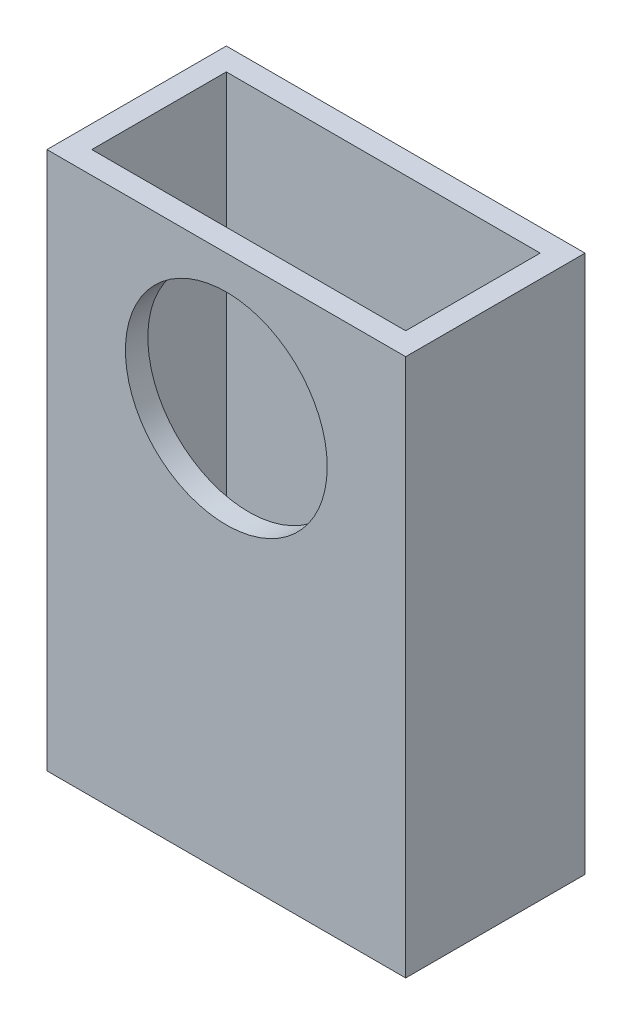
ISO-10303-21;
HEADER;
FILE_DESCRIPTION(('STEP AP214'),'2;1');
FILE_NAME('part.step','',(''),(''),'','','');
FILE_SCHEMA(('AUTOMOTIVE_DESIGN { 1 0 10303 214 1 1 1 1 }'));
ENDSEC;
DATA;
#1=APPLICATION_CONTEXT('core data for automotive mechanical design processes');
#2=APPLICATION_PROTOCOL_DEFINITION('international standard','automotive_design',2000,#1);
#3=PRODUCT_CONTEXT('',#1,'mechanical');
#4=PRODUCT('Part','Part','',(#3));
#5=PRODUCT_RELATED_PRODUCT_CATEGORY('part','',(#4));
#6=PRODUCT_DEFINITION_FORMATION('','',#4);
#7=PRODUCT_DEFINITION_CONTEXT('part definition',#1,'design');
#8=PRODUCT_DEFINITION('design','',#6,#7);
#9=PRODUCT_DEFINITION_SHAPE('','',#8);
#10=(LENGTH_UNIT() NAMED_UNIT(*) SI_UNIT(.MILLI.,.METRE.));
#11=(NAMED_UNIT(*) PLANE_ANGLE_UNIT() SI_UNIT($,.RADIAN.));
#12=(NAMED_UNIT(*) SI_UNIT($,.STERADIAN.) SOLID_ANGLE_UNIT());
#13=UNCERTAINTY_MEASURE_WITH_UNIT(LENGTH_MEASURE(1.E-05),#10,'distance_accuracy_value','');
#14=(GEOMETRIC_REPRESENTATION_CONTEXT(3) GLOBAL_UNCERTAINTY_ASSIGNED_CONTEXT((#13)) GLOBAL_UNIT_ASSIGNED_CONTEXT((#10,
#11,#12)) REPRESENTATION_CONTEXT('',''));
#15=CARTESIAN_POINT('',(0.,0.,0.));
#16=DIRECTION('',(0.,0.,1.));
#17=DIRECTION('',(1.,0.,0.));
#18=AXIS2_PLACEMENT_3D('',#15,#16,#17);
#19=CARTESIAN_POINT('',(0.,0.,25.4));
#20=DIRECTION('',(1.,0.,0.));
#21=DIRECTION('',(0.,1.,0.));
#22=AXIS2_PLACEMENT_3D('',#19,#20,#21);
#23=PLANE('',#22);
#24=DIRECTION('',(0.,-1.,0.));
#25=VECTOR('',#24,1.);
#26=CARTESIAN_POINT('',(0.,0.,0.));
#27=LINE('',#26,#25);
#28=CARTESIAN_POINT('',(0.,76.2,0.));
#29=VERTEX_POINT('',#28);
#30=CARTESIAN_POINT('',(0.,0.,0.));
#31=VERTEX_POINT('',#30);
#32=EDGE_CURVE('E150',#29,#31,#27,.T.);
#33=ORIENTED_EDGE('',*,*,#32,.T.);
#34=DIRECTION('',(0.,0.,-1.));
#35=VECTOR('',#34,1.);
#36=CARTESIAN_POINT('',(0.,0.,25.4));
#37=LINE('',#36,#35);
#38=CARTESIAN_POINT('',(0.,0.,25.4));
#39=VERTEX_POINT('',#38);
#40=EDGE_CURVE('E11',#39,#31,#37,.T.);
#41=ORIENTED_EDGE('',*,*,#40,.F.);
#42=DIRECTION('',(0.,-1.,0.));
#43=VECTOR('',#42,1.);
#44=CARTESIAN_POINT('',(0.,0.,25.4));
#45=LINE('',#44,#43);
#46=CARTESIAN_POINT('',(0.,76.2,25.4));
#47=VERTEX_POINT('',#46);
#48=EDGE_CURVE('E156',#47,#39,#45,.T.);
#49=ORIENTED_EDGE('',*,*,#48,.F.);
#50=DIRECTION('',(0.,0.,-1.));
#51=VECTOR('',#50,1.);
#52=CARTESIAN_POINT('',(0.,76.2,25.4));
#53=LINE('',#52,#51);
#54=EDGE_CURVE('E170',#47,#29,#53,.T.);
#55=ORIENTED_EDGE('',*,*,#54,.T.);
#56=EDGE_LOOP('',(#33,#41,#49,#55));
#57=FACE_BOUND('',#56,.T.);
#58=ADVANCED_FACE('F39',(#57),#23,.F.);
#59=CARTESIAN_POINT('',(0.,0.,25.4));
#60=DIRECTION('',(0.,1.,0.));
#61=DIRECTION('',(0.,0.,1.));
#62=AXIS2_PLACEMENT_3D('',#59,#60,#61);
#63=PLANE('',#62);
#64=DIRECTION('',(1.,0.,0.));
#65=VECTOR('',#64,1.);
#66=CARTESIAN_POINT('',(3.175,0.,3.175));
#67=LINE('',#66,#65);
#68=CARTESIAN_POINT('',(3.175,0.,3.175));
#69=VERTEX_POINT('',#68);
#70=CARTESIAN_POINT('',(47.625,0.,3.175));
#71=VERTEX_POINT('',#70);
#72=EDGE_CURVE('E141',#69,#71,#67,.T.);
#73=ORIENTED_EDGE('',*,*,#72,.F.);
#74=DIRECTION('',(0.,0.,-1.));
#75=VECTOR('',#74,1.);
#76=CARTESIAN_POINT('',(3.175,0.,22.225));
#77=LINE('',#76,#75);
#78=CARTESIAN_POINT('',(3.175,0.,22.225));
#79=VERTEX_POINT('',#78);
#80=EDGE_CURVE('E55',#79,#69,#77,.T.);
#81=ORIENTED_EDGE('',*,*,#80,.F.);
#82=DIRECTION('',(-1.,0.,0.));
#83=VECTOR('',#82,1.);
#84=CARTESIAN_POINT('',(3.175,0.,22.225));
#85=LINE('',#84,#83);
#86=CARTESIAN_POINT('',(47.625,0.,22.225));
#87=VERTEX_POINT('',#86);
#88=EDGE_CURVE('E126',#87,#79,#85,.T.);
#89=ORIENTED_EDGE('',*,*,#88,.F.);
#90=DIRECTION('',(0.,0.,1.));
#91=VECTOR('',#90,1.);
#92=CARTESIAN_POINT('',(47.625,0.,22.225));
#93=LINE('',#92,#91);
#94=EDGE_CURVE('E130',#71,#87,#93,.T.);
#95=ORIENTED_EDGE('',*,*,#94,.F.);
#96=EDGE_LOOP('',(#73,#81,#89,#95));
#97=FACE_BOUND('',#96,.T.);
#98=DIRECTION('',(1.,0.,0.));
#99=VECTOR('',#98,1.);
#100=CARTESIAN_POINT('',(0.,0.,0.));
#101=LINE('',#100,#99);
#102=CARTESIAN_POINT('',(50.8,0.,0.));
#103=VERTEX_POINT('',#102);
#104=EDGE_CURVE('E174',#31,#103,#101,.T.);
#105=ORIENTED_EDGE('',*,*,#104,.T.);
#106=DIRECTION('',(0.,0.,-1.));
#107=VECTOR('',#106,1.);
#108=CARTESIAN_POINT('',(50.8,0.,25.4));
#109=LINE('',#108,#107);
#110=CARTESIAN_POINT('',(50.8,0.,25.4));
#111=VERTEX_POINT('',#110);
#112=EDGE_CURVE('E48',#111,#103,#109,.T.);
#113=ORIENTED_EDGE('',*,*,#112,.F.);
#114=DIRECTION('',(1.,0.,0.));
#115=VECTOR('',#114,1.);
#116=CARTESIAN_POINT('',(0.,0.,25.4));
#117=LINE('',#116,#115);
#118=EDGE_CURVE('E160',#39,#111,#117,.T.);
#119=ORIENTED_EDGE('',*,*,#118,.F.);
#120=ORIENTED_EDGE('',*,*,#40,.T.);
#121=EDGE_LOOP('',(#105,#113,#119,#120));
#122=FACE_BOUND('',#121,.T.);
#123=ADVANCED_FACE('F209',(#97,#122),#63,.F.);
#124=CARTESIAN_POINT('',(50.8,0.,25.4));
#125=DIRECTION('',(-1.,0.,0.));
#126=DIRECTION('',(0.,-1.,0.));
#127=AXIS2_PLACEMENT_3D('',#124,#125,#126);
#128=PLANE('',#127);
#129=DIRECTION('',(0.,1.,0.));
#130=VECTOR('',#129,1.);
#131=CARTESIAN_POINT('',(50.8,0.,0.));
#132=LINE('',#131,#130);
#133=CARTESIAN_POINT('',(50.8,76.2,0.));
#134=VERTEX_POINT('',#133);
#135=EDGE_CURVE('E177',#103,#134,#132,.T.);
#136=ORIENTED_EDGE('',*,*,#135,.T.);
#137=DIRECTION('',(0.,0.,-1.));
#138=VECTOR('',#137,1.);
#139=CARTESIAN_POINT('',(50.8,76.2,25.4));
#140=LINE('',#139,#138);
#141=CARTESIAN_POINT('',(50.8,76.2,25.4));
#142=VERTEX_POINT('',#141);
#143=EDGE_CURVE('E185',#142,#134,#140,.T.);
#144=ORIENTED_EDGE('',*,*,#143,.F.);
#145=DIRECTION('',(0.,1.,0.));
#146=VECTOR('',#145,1.);
#147=CARTESIAN_POINT('',(50.8,0.,25.4));
#148=LINE('',#147,#146);
#149=EDGE_CURVE('E164',#111,#142,#148,.T.);
#150=ORIENTED_EDGE('',*,*,#149,.F.);
#151=ORIENTED_EDGE('',*,*,#112,.T.);
#152=EDGE_LOOP('',(#136,#144,#150,#151));
#153=FACE_BOUND('',#152,.T.);
#154=ADVANCED_FACE('F195',(#153),#128,.F.);
#155=CARTESIAN_POINT('',(0.,76.2,25.4));
#156=DIRECTION('',(0.,-1.,0.));
#157=DIRECTION('',(0.,0.,-1.));
#158=AXIS2_PLACEMENT_3D('',#155,#156,#157);
#159=PLANE('',#158);
#160=DIRECTION('',(-1.,0.,0.));
#161=VECTOR('',#160,1.);
#162=CARTESIAN_POINT('',(3.175,76.2,22.225));
#163=LINE('',#162,#161);
#164=CARTESIAN_POINT('',(47.625,76.2,22.225));
#165=VERTEX_POINT('',#164);
#166=CARTESIAN_POINT('',(3.175,76.2,22.225));
#167=VERTEX_POINT('',#166);
#168=EDGE_CURVE('E114',#165,#167,#163,.T.);
#169=ORIENTED_EDGE('',*,*,#168,.T.);
#170=DIRECTION('',(0.,0.,-1.));
#171=VECTOR('',#170,1.);
#172=CARTESIAN_POINT('',(3.175,76.2,22.225));
#173=LINE('',#172,#171);
#174=CARTESIAN_POINT('',(3.175,76.2,3.175));
#175=VERTEX_POINT('',#174);
#176=EDGE_CURVE('E107',#167,#175,#173,.T.);
#177=ORIENTED_EDGE('',*,*,#176,.T.);
#178=DIRECTION('',(1.,0.,0.));
#179=VECTOR('',#178,1.);
#180=CARTESIAN_POINT('',(3.175,76.2,3.175));
#181=LINE('',#180,#179);
#182=CARTESIAN_POINT('',(47.625,76.2,3.175));
#183=VERTEX_POINT('',#182);
#184=EDGE_CURVE('E117',#175,#183,#181,.T.);
#185=ORIENTED_EDGE('',*,*,#184,.T.);
#186=DIRECTION('',(0.,0.,1.));
#187=VECTOR('',#186,1.);
#188=CARTESIAN_POINT('',(47.625,76.2,22.225));
#189=LINE('',#188,#187);
#190=EDGE_CURVE('E63',#183,#165,#189,.T.);
#191=ORIENTED_EDGE('',*,*,#190,.T.);
#192=EDGE_LOOP('',(#169,#177,#185,#191));
#193=FACE_BOUND('',#192,.T.);
#194=DIRECTION('',(-1.,0.,0.));
#195=VECTOR('',#194,1.);
#196=CARTESIAN_POINT('',(0.,76.2,0.));
#197=LINE('',#196,#195);
#198=EDGE_CURVE('E161',#134,#29,#197,.T.);
#199=ORIENTED_EDGE('',*,*,#198,.T.);
#200=ORIENTED_EDGE('',*,*,#54,.F.);
#201=DIRECTION('',(-1.,0.,0.));
#202=VECTOR('',#201,1.);
#203=CARTESIAN_POINT('',(0.,76.2,25.4));
#204=LINE('',#203,#202);
#205=EDGE_CURVE('E167',#142,#47,#204,.T.);
#206=ORIENTED_EDGE('',*,*,#205,.F.);
#207=ORIENTED_EDGE('',*,*,#143,.T.);
#208=EDGE_LOOP('',(#199,#200,#206,#207));
#209=FACE_BOUND('',#208,.T.);
#210=ADVANCED_FACE('F122',(#193,#209),#159,.F.);
#211=CARTESIAN_POINT('',(0.,0.,25.4));
#212=DIRECTION('',(0.,0.,-1.));
#213=DIRECTION('',(-1.,0.,0.));
#214=AXIS2_PLACEMENT_3D('',#211,#212,#213);
#215=PLANE('',#214);
#216=CARTESIAN_POINT('',(25.4,57.15,25.4));
#217=DIRECTION('',(0.,0.,1.));
#218=DIRECTION('',(1.,0.,0.));
#219=AXIS2_PLACEMENT_3D('',#216,#217,#218);
#220=CIRCLE('',#219,14.2875);
#221=CARTESIAN_POINT('',(39.6875,57.15,25.4));
#222=VERTEX_POINT('',#221);
#223=EDGE_CURVE('E133',#222,#222,#220,.T.);
#224=ORIENTED_EDGE('',*,*,#223,.F.);
#225=EDGE_LOOP('',(#224));
#226=FACE_BOUND('',#225,.T.);
#227=ORIENTED_EDGE('',*,*,#48,.T.);
#228=ORIENTED_EDGE('',*,*,#118,.T.);
#229=ORIENTED_EDGE('',*,*,#149,.T.);
#230=ORIENTED_EDGE('',*,*,#205,.T.);
#231=EDGE_LOOP('',(#227,#228,#229,#230));
#232=FACE_BOUND('',#231,.T.);
#233=ADVANCED_FACE('F208',(#226,#232),#215,.F.);
#234=CARTESIAN_POINT('',(0.,0.,0.));
#235=DIRECTION('',(0.,0.,-1.));
#236=DIRECTION('',(-1.,0.,0.));
#237=AXIS2_PLACEMENT_3D('',#234,#235,#236);
#238=PLANE('',#237);
#239=ORIENTED_EDGE('',*,*,#32,.F.);
#240=ORIENTED_EDGE('',*,*,#198,.F.);
#241=ORIENTED_EDGE('',*,*,#135,.F.);
#242=ORIENTED_EDGE('',*,*,#104,.F.);
#243=EDGE_LOOP('',(#239,#240,#241,#242));
#244=FACE_BOUND('',#243,.T.);
#245=ADVANCED_FACE('F201',(#244),#238,.T.);
#246=CARTESIAN_POINT('',(3.175,76.2,22.225));
#247=DIRECTION('',(-1.,0.,0.));
#248=DIRECTION('',(0.,0.,1.));
#249=AXIS2_PLACEMENT_3D('',#246,#247,#248);
#250=PLANE('',#249);
#251=ORIENTED_EDGE('',*,*,#80,.T.);
#252=DIRECTION('',(0.,-1.,0.));
#253=VECTOR('',#252,1.);
#254=CARTESIAN_POINT('',(3.175,76.2,3.175));
#255=LINE('',#254,#253);
#256=EDGE_CURVE('E103',#175,#69,#255,.T.);
#257=ORIENTED_EDGE('',*,*,#256,.F.);
#258=ORIENTED_EDGE('',*,*,#176,.F.);
#259=DIRECTION('',(0.,-1.,0.));
#260=VECTOR('',#259,1.);
#261=CARTESIAN_POINT('',(3.175,76.2,22.225));
#262=LINE('',#261,#260);
#263=EDGE_CURVE('E147',#167,#79,#262,.T.);
#264=ORIENTED_EDGE('',*,*,#263,.T.);
#265=EDGE_LOOP('',(#251,#257,#258,#264));
#266=FACE_BOUND('',#265,.T.);
#267=ADVANCED_FACE('F105',(#266),#250,.F.);
#268=CARTESIAN_POINT('',(3.175,76.2,22.225));
#269=DIRECTION('',(0.,0.,1.));
#270=DIRECTION('',(1.,0.,0.));
#271=AXIS2_PLACEMENT_3D('',#268,#269,#270);
#272=PLANE('',#271);
#273=CARTESIAN_POINT('',(25.4,57.15,22.225));
#274=DIRECTION('',(0.,0.,1.));
#275=DIRECTION('',(1.,0.,0.));
#276=AXIS2_PLACEMENT_3D('',#273,#274,#275);
#277=CIRCLE('',#276,14.2875);
#278=CARTESIAN_POINT('',(39.6875,57.15,22.225));
#279=VERTEX_POINT('',#278);
#280=EDGE_CURVE('E42',#279,#279,#277,.T.);
#281=ORIENTED_EDGE('',*,*,#280,.T.);
#282=EDGE_LOOP('',(#281));
#283=FACE_BOUND('',#282,.T.);
#284=ORIENTED_EDGE('',*,*,#88,.T.);
#285=ORIENTED_EDGE('',*,*,#263,.F.);
#286=ORIENTED_EDGE('',*,*,#168,.F.);
#287=DIRECTION('',(0.,-1.,0.));
#288=VECTOR('',#287,1.);
#289=CARTESIAN_POINT('',(47.625,76.2,22.225));
#290=LINE('',#289,#288);
#291=EDGE_CURVE('E151',#165,#87,#290,.T.);
#292=ORIENTED_EDGE('',*,*,#291,.T.);
#293=EDGE_LOOP('',(#284,#285,#286,#292));
#294=FACE_BOUND('',#293,.T.);
#295=ADVANCED_FACE('F227',(#283,#294),#272,.F.);
#296=CARTESIAN_POINT('',(47.625,76.2,22.225));
#297=DIRECTION('',(1.,0.,0.));
#298=DIRECTION('',(0.,0.,-1.));
#299=AXIS2_PLACEMENT_3D('',#296,#297,#298);
#300=PLANE('',#299);
#301=ORIENTED_EDGE('',*,*,#94,.T.);
#302=ORIENTED_EDGE('',*,*,#291,.F.);
#303=ORIENTED_EDGE('',*,*,#190,.F.);
#304=DIRECTION('',(0.,-1.,0.));
#305=VECTOR('',#304,1.);
#306=CARTESIAN_POINT('',(47.625,76.2,3.175));
#307=LINE('',#306,#305);
#308=EDGE_CURVE('E113',#183,#71,#307,.T.);
#309=ORIENTED_EDGE('',*,*,#308,.T.);
#310=EDGE_LOOP('',(#301,#302,#303,#309));
#311=FACE_BOUND('',#310,.T.);
#312=ADVANCED_FACE('F231',(#311),#300,.F.);
#313=CARTESIAN_POINT('',(3.175,76.2,3.175));
#314=DIRECTION('',(0.,0.,-1.));
#315=DIRECTION('',(-1.,0.,0.));
#316=AXIS2_PLACEMENT_3D('',#313,#314,#315);
#317=PLANE('',#316);
#318=ORIENTED_EDGE('',*,*,#72,.T.);
#319=ORIENTED_EDGE('',*,*,#308,.F.);
#320=ORIENTED_EDGE('',*,*,#184,.F.);
#321=ORIENTED_EDGE('',*,*,#256,.T.);
#322=EDGE_LOOP('',(#318,#319,#320,#321));
#323=FACE_BOUND('',#322,.T.);
#324=ADVANCED_FACE('F118',(#323),#317,.F.);
#325=CARTESIAN_POINT('',(25.4,57.15,14.1233199741925));
#326=DIRECTION('',(0.,0.,1.));
#327=DIRECTION('',(1.,0.,0.));
#328=AXIS2_PLACEMENT_3D('',#325,#326,#327);
#329=CYLINDRICAL_SURFACE('',#328,14.2875);
#330=ORIENTED_EDGE('',*,*,#223,.T.);
#331=EDGE_LOOP('',(#330));
#332=FACE_BOUND('',#331,.T.);
#333=ORIENTED_EDGE('',*,*,#280,.F.);
#334=EDGE_LOOP('',(#333));
#335=FACE_BOUND('',#334,.T.);
#336=ADVANCED_FACE('F230',(#332,#335),#329,.F.);
#337=CLOSED_SHELL('',(#58,#123,#154,#210,#233,#245,#267,#295,#312,#324,#336));
#338=MANIFOLD_SOLID_BREP('B2',#337);
#339=ADVANCED_BREP_SHAPE_REPRESENTATION('',(#18,#338),#14);
#340=SHAPE_DEFINITION_REPRESENTATION(#9,#339);
ENDSEC;
END-ISO-10303-21;
